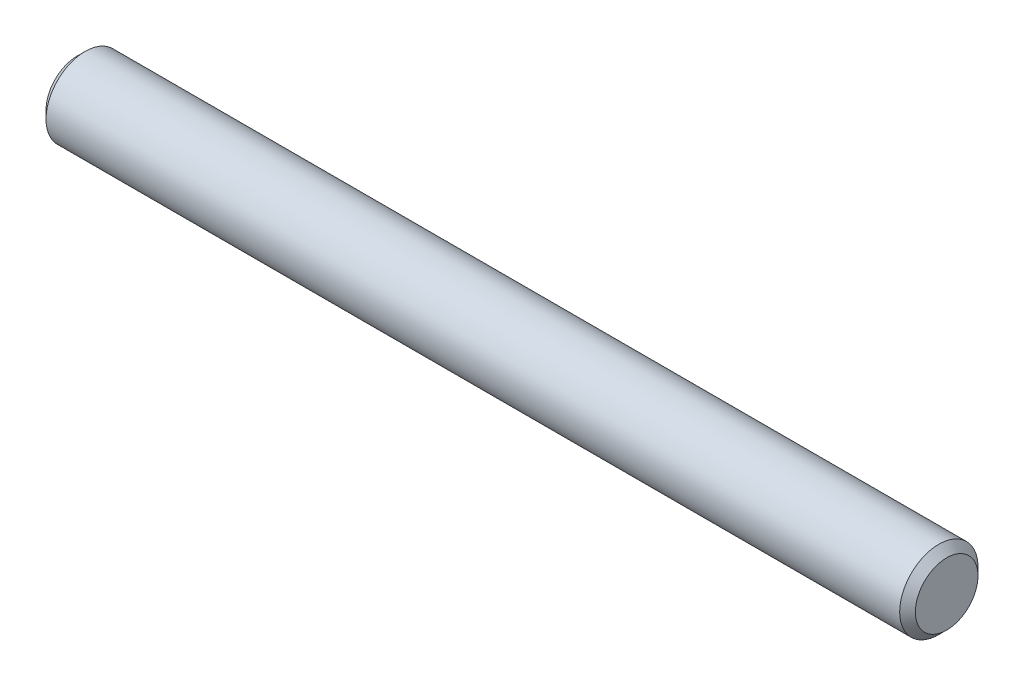
ISO-10303-21;
HEADER;
FILE_DESCRIPTION(('STEP AP214'),'2;1');
FILE_NAME('part.step','',(''),(''),'','','');
FILE_SCHEMA(('AUTOMOTIVE_DESIGN { 1 0 10303 214 1 1 1 1 }'));
ENDSEC;
DATA;
#1=APPLICATION_CONTEXT('core data for automotive mechanical design processes');
#2=APPLICATION_PROTOCOL_DEFINITION('international standard','automotive_design',2000,#1);
#3=PRODUCT_CONTEXT('',#1,'mechanical');
#4=PRODUCT('Part','Part','',(#3));
#5=PRODUCT_RELATED_PRODUCT_CATEGORY('part','',(#4));
#6=PRODUCT_DEFINITION_FORMATION('','',#4);
#7=PRODUCT_DEFINITION_CONTEXT('part definition',#1,'design');
#8=PRODUCT_DEFINITION('design','',#6,#7);
#9=PRODUCT_DEFINITION_SHAPE('','',#8);
#10=(LENGTH_UNIT() NAMED_UNIT(*) SI_UNIT(.MILLI.,.METRE.));
#11=(NAMED_UNIT(*) PLANE_ANGLE_UNIT() SI_UNIT($,.RADIAN.));
#12=(NAMED_UNIT(*) SI_UNIT($,.STERADIAN.) SOLID_ANGLE_UNIT());
#13=UNCERTAINTY_MEASURE_WITH_UNIT(LENGTH_MEASURE(1.E-05),#10,'distance_accuracy_value','');
#14=(GEOMETRIC_REPRESENTATION_CONTEXT(3) GLOBAL_UNCERTAINTY_ASSIGNED_CONTEXT((#13)) GLOBAL_UNIT_ASSIGNED_CONTEXT((#10,
#11,#12)) REPRESENTATION_CONTEXT('',''));
#15=CARTESIAN_POINT('',(0.,0.,0.));
#16=DIRECTION('',(0.,0.,1.));
#17=DIRECTION('',(1.,0.,0.));
#18=AXIS2_PLACEMENT_3D('',#15,#16,#17);
#19=CARTESIAN_POINT('',(11.1,0.,0.));
#20=DIRECTION('',(1.,0.,0.));
#21=DIRECTION('',(0.,0.,-1.));
#22=AXIS2_PLACEMENT_3D('',#19,#20,#21);
#23=PLANE('',#22);
#24=CARTESIAN_POINT('',(11.0999999999422,0.,0.));
#25=DIRECTION('',(-1.,0.,0.));
#26=DIRECTION('',(0.,0.,1.));
#27=AXIS2_PLACEMENT_3D('',#24,#25,#26);
#28=CIRCLE('',#27,0.800000000026557);
#29=CARTESIAN_POINT('',(11.0999999999422,0.,0.800000000026557));
#30=VERTEX_POINT('',#29);
#31=EDGE_CURVE('E18',#30,#30,#28,.T.);
#32=ORIENTED_EDGE('',*,*,#31,.F.);
#33=EDGE_LOOP('',(#32));
#34=FACE_BOUND('',#33,.T.);
#35=ADVANCED_FACE('F15',(#34),#23,.T.);
#36=CARTESIAN_POINT('',(-11.1,0.,0.));
#37=DIRECTION('',(-1.,0.,0.));
#38=DIRECTION('',(0.,0.,1.));
#39=AXIS2_PLACEMENT_3D('',#36,#37,#38);
#40=PLANE('',#39);
#41=CARTESIAN_POINT('',(-11.0999999999422,0.,0.));
#42=DIRECTION('',(1.,0.,0.));
#43=DIRECTION('',(0.,0.,-1.));
#44=AXIS2_PLACEMENT_3D('',#41,#42,#43);
#45=CIRCLE('',#44,0.800000000026557);
#46=CARTESIAN_POINT('',(-11.0999999999422,0.,-0.800000000026557));
#47=VERTEX_POINT('',#46);
#48=EDGE_CURVE('E27',#47,#47,#45,.T.);
#49=ORIENTED_EDGE('',*,*,#48,.F.);
#50=EDGE_LOOP('',(#49));
#51=FACE_BOUND('',#50,.T.);
#52=ADVANCED_FACE('F38',(#51),#40,.T.);
#53=CARTESIAN_POINT('',(10.900000000106,0.,0.));
#54=DIRECTION('',(-1.,0.,0.));
#55=DIRECTION('',(0.,0.,1.));
#56=AXIS2_PLACEMENT_3D('',#53,#54,#55);
#57=CONICAL_SURFACE('',#56,0.999999999862666,0.785398163397448);
#58=CARTESIAN_POINT('',(10.9,0.,0.));
#59=DIRECTION('',(-1.,0.,0.));
#60=DIRECTION('',(0.,0.,1.));
#61=AXIS2_PLACEMENT_3D('',#58,#59,#60);
#62=CIRCLE('',#61,1.);
#63=CARTESIAN_POINT('',(10.9,0.,1.));
#64=VERTEX_POINT('',#63);
#65=EDGE_CURVE('E22',#64,#64,#62,.T.);
#66=ORIENTED_EDGE('',*,*,#65,.F.);
#67=EDGE_LOOP('',(#66));
#68=FACE_BOUND('',#67,.T.);
#69=ORIENTED_EDGE('',*,*,#31,.T.);
#70=EDGE_LOOP('',(#69));
#71=FACE_BOUND('',#70,.T.);
#72=ADVANCED_FACE('F35',(#68,#71),#57,.T.);
#73=CARTESIAN_POINT('',(-10.900000000106,0.,0.));
#74=DIRECTION('',(1.,0.,0.));
#75=DIRECTION('',(0.,0.,-1.));
#76=AXIS2_PLACEMENT_3D('',#73,#74,#75);
#77=CONICAL_SURFACE('',#76,0.999999999862666,0.785398163397448);
#78=CARTESIAN_POINT('',(-10.9,0.,0.));
#79=DIRECTION('',(-1.,0.,0.));
#80=DIRECTION('',(0.,0.,1.));
#81=AXIS2_PLACEMENT_3D('',#78,#79,#80);
#82=CIRCLE('',#81,1.);
#83=CARTESIAN_POINT('',(-10.9,0.,1.));
#84=VERTEX_POINT('',#83);
#85=EDGE_CURVE('E10',#84,#84,#82,.F.);
#86=ORIENTED_EDGE('',*,*,#85,.F.);
#87=EDGE_LOOP('',(#86));
#88=FACE_BOUND('',#87,.T.);
#89=ORIENTED_EDGE('',*,*,#48,.T.);
#90=EDGE_LOOP('',(#89));
#91=FACE_BOUND('',#90,.T.);
#92=ADVANCED_FACE('F46',(#88,#91),#77,.T.);
#93=CARTESIAN_POINT('',(-8.4,0.,0.));
#94=DIRECTION('',(-1.,0.,0.));
#95=DIRECTION('',(0.,0.,1.));
#96=AXIS2_PLACEMENT_3D('',#93,#94,#95);
#97=CYLINDRICAL_SURFACE('',#96,1.);
#98=ORIENTED_EDGE('',*,*,#85,.T.);
#99=EDGE_LOOP('',(#98));
#100=FACE_BOUND('',#99,.T.);
#101=ORIENTED_EDGE('',*,*,#65,.T.);
#102=EDGE_LOOP('',(#101));
#103=FACE_BOUND('',#102,.T.);
#104=ADVANCED_FACE('F44',(#100,#103),#97,.T.);
#105=CLOSED_SHELL('',(#35,#52,#72,#92,#104));
#106=MANIFOLD_SOLID_BREP('B1',#105);
#107=ADVANCED_BREP_SHAPE_REPRESENTATION('',(#18,#106),#14);
#108=SHAPE_DEFINITION_REPRESENTATION(#9,#107);
ENDSEC;
END-ISO-10303-21;
